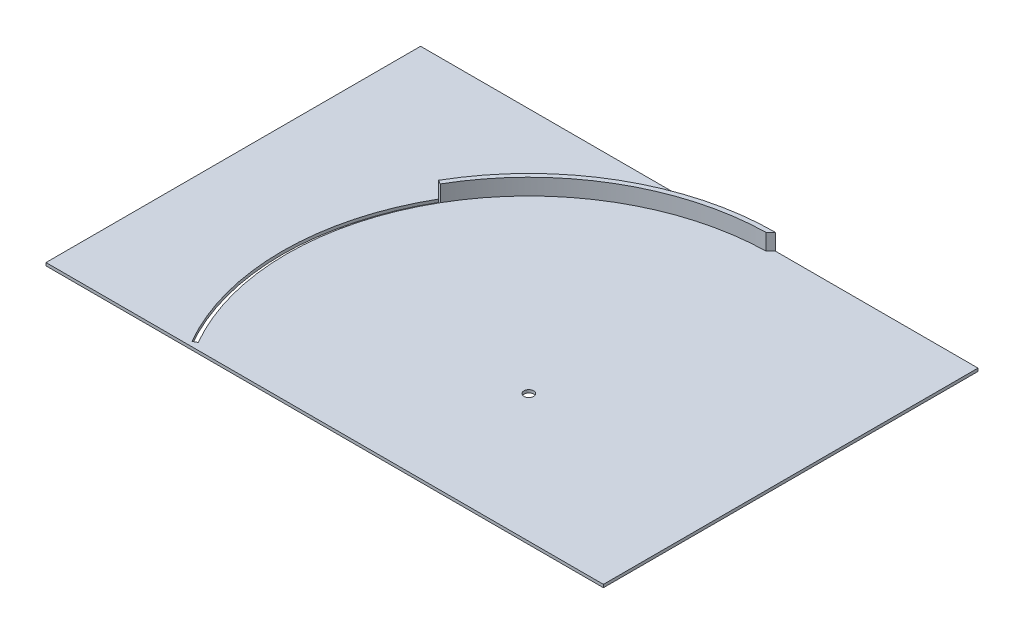
ISO-10303-21;
HEADER;
FILE_DESCRIPTION(('STEP AP214'),'2;1');
FILE_NAME('part.step','',(''),(''),'','','');
FILE_SCHEMA(('AUTOMOTIVE_DESIGN { 1 0 10303 214 1 1 1 1 }'));
ENDSEC;
DATA;
#1=APPLICATION_CONTEXT('core data for automotive mechanical design processes');
#2=APPLICATION_PROTOCOL_DEFINITION('international standard','automotive_design',2000,#1);
#3=PRODUCT_CONTEXT('',#1,'mechanical');
#4=PRODUCT('Part','Part','',(#3));
#5=PRODUCT_RELATED_PRODUCT_CATEGORY('part','',(#4));
#6=PRODUCT_DEFINITION_FORMATION('','',#4);
#7=PRODUCT_DEFINITION_CONTEXT('part definition',#1,'design');
#8=PRODUCT_DEFINITION('design','',#6,#7);
#9=PRODUCT_DEFINITION_SHAPE('','',#8);
#10=(LENGTH_UNIT() NAMED_UNIT(*) SI_UNIT(.MILLI.,.METRE.));
#11=(NAMED_UNIT(*) PLANE_ANGLE_UNIT() SI_UNIT($,.RADIAN.));
#12=(NAMED_UNIT(*) SI_UNIT($,.STERADIAN.) SOLID_ANGLE_UNIT());
#13=UNCERTAINTY_MEASURE_WITH_UNIT(LENGTH_MEASURE(1.E-05),#10,'distance_accuracy_value','');
#14=(GEOMETRIC_REPRESENTATION_CONTEXT(3) GLOBAL_UNCERTAINTY_ASSIGNED_CONTEXT((#13)) GLOBAL_UNIT_ASSIGNED_CONTEXT((#10,
#11,#12)) REPRESENTATION_CONTEXT('',''));
#15=CARTESIAN_POINT('',(0.,0.,0.));
#16=DIRECTION('',(0.,0.,1.));
#17=DIRECTION('',(1.,0.,0.));
#18=AXIS2_PLACEMENT_3D('',#15,#16,#17);
#19=CARTESIAN_POINT('',(0.,35.,0.));
#20=DIRECTION('',(0.,-1.,0.));
#21=DIRECTION('',(0.,0.,-1.));
#22=AXIS2_PLACEMENT_3D('',#19,#20,#21);
#23=CYLINDRICAL_SURFACE('',#22,521.);
#24=CARTESIAN_POINT('',(0.,0.,0.));
#25=DIRECTION('',(0.,-1.,0.));
#26=DIRECTION('',(0.,0.,1.));
#27=AXIS2_PLACEMENT_3D('',#24,#25,#26);
#28=CIRCLE('',#27,521.);
#29=CARTESIAN_POINT('',(-451.199235371692,0.,-260.5));
#30=VERTEX_POINT('',#29);
#31=CARTESIAN_POINT('',(-10.0978661013188,0.,-520.902133898681));
#32=VERTEX_POINT('',#31);
#33=EDGE_CURVE('E227',#30,#32,#28,.T.);
#34=ORIENTED_EDGE('',*,*,#33,.T.);
#35=DIRECTION('',(0.,-1.,0.));
#36=VECTOR('',#35,1.);
#37=CARTESIAN_POINT('',(-10.0978661013188,35.,-520.902133898681));
#38=LINE('',#37,#36);
#39=CARTESIAN_POINT('',(-10.0978661013188,35.,-520.902133898681));
#40=VERTEX_POINT('',#39);
#41=EDGE_CURVE('E70',#32,#40,#38,.F.);
#42=ORIENTED_EDGE('',*,*,#41,.T.);
#43=CARTESIAN_POINT('',(0.,35.,0.));
#44=DIRECTION('',(0.,-1.,0.));
#45=DIRECTION('',(0.,0.,1.));
#46=AXIS2_PLACEMENT_3D('',#43,#44,#45);
#47=CIRCLE('',#46,521.);
#48=CARTESIAN_POINT('',(-451.199235371692,35.,-260.5));
#49=VERTEX_POINT('',#48);
#50=EDGE_CURVE('E236',#49,#40,#47,.T.);
#51=ORIENTED_EDGE('',*,*,#50,.F.);
#52=DIRECTION('',(0.,-1.,0.));
#53=VECTOR('',#52,1.);
#54=CARTESIAN_POINT('',(-451.199235371692,35.,-260.5));
#55=LINE('',#54,#53);
#56=EDGE_CURVE('E246',#49,#30,#55,.T.);
#57=ORIENTED_EDGE('',*,*,#56,.T.);
#58=EDGE_LOOP('',(#34,#42,#51,#57));
#59=FACE_BOUND('',#58,.T.);
#60=ADVANCED_FACE('F45',(#59),#23,.F.);
#61=CARTESIAN_POINT('',(0.,35.,0.));
#62=DIRECTION('',(0.,-1.,0.));
#63=DIRECTION('',(0.,0.,-1.));
#64=AXIS2_PLACEMENT_3D('',#61,#62,#63);
#65=CYLINDRICAL_SURFACE('',#64,531.);
#66=CARTESIAN_POINT('',(0.,0.,0.));
#67=DIRECTION('',(0.,1.,0.));
#68=DIRECTION('',(0.,0.,1.));
#69=AXIS2_PLACEMENT_3D('',#66,#67,#68);
#70=CIRCLE('',#69,531.);
#71=CARTESIAN_POINT('',(0.,0.,-531.));
#72=VERTEX_POINT('',#71);
#73=CARTESIAN_POINT('',(-459.859489409537,0.,-265.500000000001));
#74=VERTEX_POINT('',#73);
#75=EDGE_CURVE('E240',#72,#74,#70,.T.);
#76=ORIENTED_EDGE('',*,*,#75,.T.);
#77=DIRECTION('',(0.,-1.,0.));
#78=VECTOR('',#77,1.);
#79=CARTESIAN_POINT('',(-459.859489409537,35.,-265.500000000001));
#80=LINE('',#79,#78);
#81=CARTESIAN_POINT('',(-459.859489409537,35.,-265.500000000001));
#82=VERTEX_POINT('',#81);
#83=EDGE_CURVE('E255',#82,#74,#80,.T.);
#84=ORIENTED_EDGE('',*,*,#83,.F.);
#85=CARTESIAN_POINT('',(0.,35.,0.));
#86=DIRECTION('',(0.,1.,0.));
#87=DIRECTION('',(0.,0.,1.));
#88=AXIS2_PLACEMENT_3D('',#85,#86,#87);
#89=CIRCLE('',#88,531.);
#90=CARTESIAN_POINT('',(0.,35.,-531.));
#91=VERTEX_POINT('',#90);
#92=EDGE_CURVE('E239',#91,#82,#89,.T.);
#93=ORIENTED_EDGE('',*,*,#92,.F.);
#94=DIRECTION('',(0.,-1.,0.));
#95=VECTOR('',#94,1.);
#96=CARTESIAN_POINT('',(0.,35.,-531.));
#97=LINE('',#96,#95);
#98=EDGE_CURVE('E258',#91,#72,#97,.T.);
#99=ORIENTED_EDGE('',*,*,#98,.T.);
#100=EDGE_LOOP('',(#76,#84,#93,#99));
#101=FACE_BOUND('',#100,.T.);
#102=ADVANCED_FACE('F272',(#101),#65,.T.);
#103=CARTESIAN_POINT('',(-459.859489409537,35.,-265.5));
#104=DIRECTION('',(0.499999999999987,0.,-0.866025403784446));
#105=DIRECTION('',(-0.866025403784446,0.,-0.499999999999987));
#106=AXIS2_PLACEMENT_3D('',#103,#104,#105);
#107=PLANE('',#106);
#108=ORIENTED_EDGE('',*,*,#83,.T.);
#109=DIRECTION('',(0.,1.,0.));
#110=VECTOR('',#109,1.);
#111=CARTESIAN_POINT('',(-459.859489409537,-6.35,-265.500000000001));
#112=LINE('',#111,#110);
#113=CARTESIAN_POINT('',(-459.859489409537,-6.35,-265.500000000001));
#114=VERTEX_POINT('',#113);
#115=EDGE_CURVE('E143',#114,#74,#112,.T.);
#116=ORIENTED_EDGE('',*,*,#115,.F.);
#117=DIRECTION('',(-0.866025403784432,0.,-0.500000000000011));
#118=VECTOR('',#117,1.);
#119=CARTESIAN_POINT('',(-451.199235371692,-6.35,-260.5));
#120=LINE('',#119,#118);
#121=CARTESIAN_POINT('',(-451.199235371692,-6.35,-260.5));
#122=VERTEX_POINT('',#121);
#123=EDGE_CURVE('E147',#122,#114,#120,.T.);
#124=ORIENTED_EDGE('',*,*,#123,.F.);
#125=DIRECTION('',(0.,1.,0.));
#126=VECTOR('',#125,1.);
#127=CARTESIAN_POINT('',(-451.199235371692,-6.35,-260.5));
#128=LINE('',#127,#126);
#129=EDGE_CURVE('E131',#122,#30,#128,.T.);
#130=ORIENTED_EDGE('',*,*,#129,.T.);
#131=ORIENTED_EDGE('',*,*,#56,.F.);
#132=DIRECTION('',(0.866025403784446,0.,0.499999999999987));
#133=VECTOR('',#132,1.);
#134=CARTESIAN_POINT('',(-459.859489409537,35.,-265.5));
#135=LINE('',#134,#133);
#136=EDGE_CURVE('E243',#82,#49,#135,.T.);
#137=ORIENTED_EDGE('',*,*,#136,.F.);
#138=EDGE_LOOP('',(#108,#116,#124,#130,#131,#137));
#139=FACE_BOUND('',#138,.T.);
#140=ADVANCED_FACE('F149',(#139),#107,.F.);
#141=CARTESIAN_POINT('',(0.,35.,0.));
#142=DIRECTION('',(0.,1.,0.));
#143=DIRECTION('',(0.,0.,1.));
#144=AXIS2_PLACEMENT_3D('',#141,#142,#143);
#145=PLANE('',#144);
#146=ORIENTED_EDGE('',*,*,#50,.T.);
#147=DIRECTION('',(-0.707106781186547,0.,0.707106781186548));
#148=VECTOR('',#147,1.);
#149=CARTESIAN_POINT('',(-265.5,35.,-265.5));
#150=LINE('',#149,#148);
#151=EDGE_CURVE('E55',#40,#91,#150,.F.);
#152=ORIENTED_EDGE('',*,*,#151,.T.);
#153=ORIENTED_EDGE('',*,*,#92,.T.);
#154=ORIENTED_EDGE('',*,*,#136,.T.);
#155=EDGE_LOOP('',(#146,#152,#153,#154));
#156=FACE_BOUND('',#155,.T.);
#157=ADVANCED_FACE('F267',(#156),#145,.T.);
#158=CARTESIAN_POINT('',(-764.07,-6.35,275.4));
#159=DIRECTION('',(-1.,0.,0.));
#160=DIRECTION('',(0.,0.,1.));
#161=AXIS2_PLACEMENT_3D('',#158,#159,#160);
#162=PLANE('',#161);
#163=DIRECTION('',(0.,0.,1.));
#164=VECTOR('',#163,1.);
#165=CARTESIAN_POINT('',(-764.07,0.,275.4));
#166=LINE('',#165,#164);
#167=CARTESIAN_POINT('',(-764.07,0.,-531.));
#168=VERTEX_POINT('',#167);
#169=CARTESIAN_POINT('',(-764.07,0.,275.4));
#170=VERTEX_POINT('',#169);
#171=EDGE_CURVE('E189',#168,#170,#166,.T.);
#172=ORIENTED_EDGE('',*,*,#171,.F.);
#173=DIRECTION('',(0.,1.,0.));
#174=VECTOR('',#173,1.);
#175=CARTESIAN_POINT('',(-764.07,-6.35,-531.));
#176=LINE('',#175,#174);
#177=CARTESIAN_POINT('',(-764.07,-6.35,-531.));
#178=VERTEX_POINT('',#177);
#179=EDGE_CURVE('E223',#178,#168,#176,.T.);
#180=ORIENTED_EDGE('',*,*,#179,.F.);
#181=DIRECTION('',(0.,0.,1.));
#182=VECTOR('',#181,1.);
#183=CARTESIAN_POINT('',(-764.07,-6.35,275.4));
#184=LINE('',#183,#182);
#185=CARTESIAN_POINT('',(-764.07,-6.35,275.4));
#186=VERTEX_POINT('',#185);
#187=EDGE_CURVE('E190',#178,#186,#184,.T.);
#188=ORIENTED_EDGE('',*,*,#187,.T.);
#189=DIRECTION('',(0.,1.,0.));
#190=VECTOR('',#189,1.);
#191=CARTESIAN_POINT('',(-764.07,-6.35,275.4));
#192=LINE('',#191,#190);
#193=EDGE_CURVE('E207',#186,#170,#192,.T.);
#194=ORIENTED_EDGE('',*,*,#193,.T.);
#195=EDGE_LOOP('',(#172,#180,#188,#194));
#196=FACE_BOUND('',#195,.T.);
#197=ADVANCED_FACE('F296',(#196),#162,.T.);
#198=CARTESIAN_POINT('',(-764.07,-6.35,-531.));
#199=DIRECTION('',(0.,0.,-1.));
#200=DIRECTION('',(-1.,0.,0.));
#201=AXIS2_PLACEMENT_3D('',#198,#199,#200);
#202=PLANE('',#201);
#203=DIRECTION('',(-1.,0.,0.));
#204=VECTOR('',#203,1.);
#205=CARTESIAN_POINT('',(-764.07,0.,-531.));
#206=LINE('',#205,#204);
#207=CARTESIAN_POINT('',(435.93,0.,-531.));
#208=VERTEX_POINT('',#207);
#209=EDGE_CURVE('E195',#208,#72,#206,.T.);
#210=ORIENTED_EDGE('',*,*,#209,.F.);
#211=DIRECTION('',(0.,1.,0.));
#212=VECTOR('',#211,1.);
#213=CARTESIAN_POINT('',(435.93,-6.35,-531.));
#214=LINE('',#213,#212);
#215=CARTESIAN_POINT('',(435.93,-6.35,-531.));
#216=VERTEX_POINT('',#215);
#217=EDGE_CURVE('E228',#216,#208,#214,.T.);
#218=ORIENTED_EDGE('',*,*,#217,.F.);
#219=DIRECTION('',(-1.,0.,0.));
#220=VECTOR('',#219,1.);
#221=CARTESIAN_POINT('',(-764.07,-6.35,-531.));
#222=LINE('',#221,#220);
#223=EDGE_CURVE('E203',#216,#178,#222,.T.);
#224=ORIENTED_EDGE('',*,*,#223,.T.);
#225=ORIENTED_EDGE('',*,*,#179,.T.);
#226=EDGE_CURVE('E219',#72,#168,#206,.T.);
#227=ORIENTED_EDGE('',*,*,#226,.F.);
#228=EDGE_LOOP('',(#210,#218,#224,#225,#227));
#229=FACE_BOUND('',#228,.T.);
#230=ADVANCED_FACE('F281',(#229),#202,.T.);
#231=CARTESIAN_POINT('',(435.93,-6.35,275.4));
#232=DIRECTION('',(1.,0.,0.));
#233=DIRECTION('',(0.,0.,-1.));
#234=AXIS2_PLACEMENT_3D('',#231,#232,#233);
#235=PLANE('',#234);
#236=DIRECTION('',(0.,0.,-1.));
#237=VECTOR('',#236,1.);
#238=CARTESIAN_POINT('',(435.93,0.,275.4));
#239=LINE('',#238,#237);
#240=CARTESIAN_POINT('',(435.93,0.,275.4));
#241=VERTEX_POINT('',#240);
#242=EDGE_CURVE('E215',#241,#208,#239,.T.);
#243=ORIENTED_EDGE('',*,*,#242,.F.);
#244=DIRECTION('',(0.,1.,0.));
#245=VECTOR('',#244,1.);
#246=CARTESIAN_POINT('',(435.93,-6.35,275.4));
#247=LINE('',#246,#245);
#248=CARTESIAN_POINT('',(435.93,-6.35,275.4));
#249=VERTEX_POINT('',#248);
#250=EDGE_CURVE('E231',#249,#241,#247,.T.);
#251=ORIENTED_EDGE('',*,*,#250,.F.);
#252=DIRECTION('',(0.,0.,-1.));
#253=VECTOR('',#252,1.);
#254=CARTESIAN_POINT('',(435.93,-6.35,275.4));
#255=LINE('',#254,#253);
#256=EDGE_CURVE('E199',#249,#216,#255,.T.);
#257=ORIENTED_EDGE('',*,*,#256,.T.);
#258=ORIENTED_EDGE('',*,*,#217,.T.);
#259=EDGE_LOOP('',(#243,#251,#257,#258));
#260=FACE_BOUND('',#259,.T.);
#261=ADVANCED_FACE('F303',(#260),#235,.T.);
#262=CARTESIAN_POINT('',(-764.07,-6.35,275.4));
#263=DIRECTION('',(0.,0.,1.));
#264=DIRECTION('',(1.,0.,0.));
#265=AXIS2_PLACEMENT_3D('',#262,#263,#264);
#266=PLANE('',#265);
#267=DIRECTION('',(1.,0.,0.));
#268=VECTOR('',#267,1.);
#269=CARTESIAN_POINT('',(-764.07,0.,275.4));
#270=LINE('',#269,#268);
#271=EDGE_CURVE('E211',#170,#241,#270,.T.);
#272=ORIENTED_EDGE('',*,*,#271,.F.);
#273=ORIENTED_EDGE('',*,*,#193,.F.);
#274=DIRECTION('',(1.,0.,0.));
#275=VECTOR('',#274,1.);
#276=CARTESIAN_POINT('',(-764.07,-6.35,275.4));
#277=LINE('',#276,#275);
#278=EDGE_CURVE('E194',#186,#249,#277,.T.);
#279=ORIENTED_EDGE('',*,*,#278,.T.);
#280=ORIENTED_EDGE('',*,*,#250,.T.);
#281=EDGE_LOOP('',(#272,#273,#279,#280));
#282=FACE_BOUND('',#281,.T.);
#283=ADVANCED_FACE('F300',(#282),#266,.T.);
#284=CARTESIAN_POINT('',(0.,-6.35,0.));
#285=DIRECTION('',(0.,-1.,0.));
#286=DIRECTION('',(0.,0.,-1.));
#287=AXIS2_PLACEMENT_3D('',#284,#285,#286);
#288=PLANE('',#287);
#289=CARTESIAN_POINT('',(0.,-6.35,0.));
#290=DIRECTION('',(0.,-1.,0.));
#291=DIRECTION('',(0.,0.,1.));
#292=AXIS2_PLACEMENT_3D('',#289,#290,#291);
#293=CIRCLE('',#292,521.);
#294=CARTESIAN_POINT('',(-451.199235371692,-6.35,260.500000000001));
#295=VERTEX_POINT('',#294);
#296=EDGE_CURVE('E135',#295,#122,#293,.T.);
#297=ORIENTED_EDGE('',*,*,#296,.T.);
#298=ORIENTED_EDGE('',*,*,#123,.T.);
#299=CARTESIAN_POINT('',(0.,-6.35,0.));
#300=DIRECTION('',(0.,1.,0.));
#301=DIRECTION('',(0.,0.,1.));
#302=AXIS2_PLACEMENT_3D('',#299,#300,#301);
#303=CIRCLE('',#302,531.);
#304=CARTESIAN_POINT('',(-459.859489409537,-6.35,265.5));
#305=VERTEX_POINT('',#304);
#306=EDGE_CURVE('E62',#114,#305,#303,.T.);
#307=ORIENTED_EDGE('',*,*,#306,.T.);
#308=DIRECTION('',(0.866025403784439,0.,-0.499999999999999));
#309=VECTOR('',#308,1.);
#310=CARTESIAN_POINT('',(-451.199235371692,-6.35,260.500000000001));
#311=LINE('',#310,#309);
#312=EDGE_CURVE('E144',#305,#295,#311,.T.);
#313=ORIENTED_EDGE('',*,*,#312,.T.);
#314=EDGE_LOOP('',(#297,#298,#307,#313));
#315=FACE_BOUND('',#314,.T.);
#316=CARTESIAN_POINT('',(0.,-6.35,0.));
#317=DIRECTION('',(0.,1.,0.));
#318=DIRECTION('',(0.,0.,1.));
#319=AXIS2_PLACEMENT_3D('',#316,#317,#318);
#320=CIRCLE('',#319,10.5);
#321=CARTESIAN_POINT('',(0.,-6.35,10.5));
#322=VERTEX_POINT('',#321);
#323=EDGE_CURVE('E185',#322,#322,#320,.T.);
#324=ORIENTED_EDGE('',*,*,#323,.T.);
#325=EDGE_LOOP('',(#324));
#326=FACE_BOUND('',#325,.T.);
#327=ORIENTED_EDGE('',*,*,#187,.F.);
#328=ORIENTED_EDGE('',*,*,#223,.F.);
#329=ORIENTED_EDGE('',*,*,#256,.F.);
#330=ORIENTED_EDGE('',*,*,#278,.F.);
#331=EDGE_LOOP('',(#327,#328,#329,#330));
#332=FACE_BOUND('',#331,.T.);
#333=ADVANCED_FACE('F153',(#315,#326,#332),#288,.T.);
#334=CARTESIAN_POINT('',(0.,0.,0.));
#335=DIRECTION('',(0.,-1.,0.));
#336=DIRECTION('',(0.,0.,-1.));
#337=AXIS2_PLACEMENT_3D('',#334,#335,#336);
#338=PLANE('',#337);
#339=CARTESIAN_POINT('',(0.,0.,0.));
#340=DIRECTION('',(0.,1.,0.));
#341=DIRECTION('',(0.,0.,1.));
#342=AXIS2_PLACEMENT_3D('',#339,#340,#341);
#343=CIRCLE('',#342,10.5);
#344=CARTESIAN_POINT('',(0.,0.,10.5));
#345=VERTEX_POINT('',#344);
#346=EDGE_CURVE('E176',#345,#345,#343,.T.);
#347=ORIENTED_EDGE('',*,*,#346,.F.);
#348=EDGE_LOOP('',(#347));
#349=FACE_BOUND('',#348,.T.);
#350=ORIENTED_EDGE('',*,*,#33,.F.);
#351=CARTESIAN_POINT('',(0.,0.,0.));
#352=DIRECTION('',(0.,-1.,0.));
#353=DIRECTION('',(0.,0.,1.));
#354=AXIS2_PLACEMENT_3D('',#351,#352,#353);
#355=CIRCLE('',#354,521.);
#356=CARTESIAN_POINT('',(-451.199235371692,0.,260.500000000001));
#357=VERTEX_POINT('',#356);
#358=EDGE_CURVE('E138',#357,#30,#355,.T.);
#359=ORIENTED_EDGE('',*,*,#358,.F.);
#360=DIRECTION('',(0.866025403784439,0.,-0.499999999999999));
#361=VECTOR('',#360,1.);
#362=CARTESIAN_POINT('',(-451.199235371692,0.,260.500000000001));
#363=LINE('',#362,#361);
#364=CARTESIAN_POINT('',(-459.859489409537,0.,265.5));
#365=VERTEX_POINT('',#364);
#366=EDGE_CURVE('E157',#365,#357,#363,.T.);
#367=ORIENTED_EDGE('',*,*,#366,.F.);
#368=CARTESIAN_POINT('',(0.,0.,0.));
#369=DIRECTION('',(0.,1.,0.));
#370=DIRECTION('',(0.,0.,1.));
#371=AXIS2_PLACEMENT_3D('',#368,#369,#370);
#372=CIRCLE('',#371,531.);
#373=EDGE_CURVE('E161',#74,#365,#372,.T.);
#374=ORIENTED_EDGE('',*,*,#373,.F.);
#375=ORIENTED_EDGE('',*,*,#75,.F.);
#376=ORIENTED_EDGE('',*,*,#226,.T.);
#377=ORIENTED_EDGE('',*,*,#171,.T.);
#378=ORIENTED_EDGE('',*,*,#271,.T.);
#379=ORIENTED_EDGE('',*,*,#242,.T.);
#380=ORIENTED_EDGE('',*,*,#209,.T.);
#381=DIRECTION('',(0.707106781186547,0.,-0.707106781186548));
#382=VECTOR('',#381,1.);
#383=CARTESIAN_POINT('',(-265.5,0.,-265.5));
#384=LINE('',#383,#382);
#385=EDGE_CURVE('E11',#72,#32,#384,.F.);
#386=ORIENTED_EDGE('',*,*,#385,.T.);
#387=EDGE_LOOP('',(#350,#359,#367,#374,#375,#376,#377,#378,#379,#380,#386));
#388=FACE_BOUND('',#387,.T.);
#389=ADVANCED_FACE('F277',(#349,#388),#338,.F.);
#390=CARTESIAN_POINT('',(0.,35.,-531.));
#391=DIRECTION('',(-0.707106781186548,0.,-0.707106781186547));
#392=DIRECTION('',(0.,-1.,0.));
#393=AXIS2_PLACEMENT_3D('',#390,#391,#392);
#394=PLANE('',#393);
#395=ORIENTED_EDGE('',*,*,#151,.F.);
#396=ORIENTED_EDGE('',*,*,#41,.F.);
#397=ORIENTED_EDGE('',*,*,#385,.F.);
#398=ORIENTED_EDGE('',*,*,#98,.F.);
#399=EDGE_LOOP('',(#395,#396,#397,#398));
#400=FACE_BOUND('',#399,.T.);
#401=ADVANCED_FACE('F48',(#400),#394,.F.);
#402=CARTESIAN_POINT('',(0.,0.,0.));
#403=DIRECTION('',(0.,1.,0.));
#404=DIRECTION('',(0.,0.,1.));
#405=AXIS2_PLACEMENT_3D('',#402,#403,#404);
#406=CYLINDRICAL_SURFACE('',#405,10.5);
#407=ORIENTED_EDGE('',*,*,#323,.F.);
#408=EDGE_LOOP('',(#407));
#409=FACE_BOUND('',#408,.T.);
#410=ORIENTED_EDGE('',*,*,#346,.T.);
#411=EDGE_LOOP('',(#410));
#412=FACE_BOUND('',#411,.T.);
#413=ADVANCED_FACE('F315',(#409,#412),#406,.F.);
#414=CARTESIAN_POINT('',(0.,-6.35,0.));
#415=DIRECTION('',(0.,1.,0.));
#416=DIRECTION('',(0.,0.,1.));
#417=AXIS2_PLACEMENT_3D('',#414,#415,#416);
#418=CYLINDRICAL_SURFACE('',#417,521.);
#419=ORIENTED_EDGE('',*,*,#358,.T.);
#420=ORIENTED_EDGE('',*,*,#129,.F.);
#421=ORIENTED_EDGE('',*,*,#296,.F.);
#422=DIRECTION('',(0.,1.,0.));
#423=VECTOR('',#422,1.);
#424=CARTESIAN_POINT('',(-451.199235371692,-6.35,260.500000000001));
#425=LINE('',#424,#423);
#426=EDGE_CURVE('E173',#295,#357,#425,.T.);
#427=ORIENTED_EDGE('',*,*,#426,.T.);
#428=EDGE_LOOP('',(#419,#420,#421,#427));
#429=FACE_BOUND('',#428,.T.);
#430=ADVANCED_FACE('F133',(#429),#418,.T.);
#431=CARTESIAN_POINT('',(-451.199235371692,-6.35,260.500000000001));
#432=DIRECTION('',(0.499999999999999,0.,0.866025403784439));
#433=DIRECTION('',(0.866025403784439,0.,-0.499999999999999));
#434=AXIS2_PLACEMENT_3D('',#431,#432,#433);
#435=PLANE('',#434);
#436=ORIENTED_EDGE('',*,*,#366,.T.);
#437=ORIENTED_EDGE('',*,*,#426,.F.);
#438=ORIENTED_EDGE('',*,*,#312,.F.);
#439=DIRECTION('',(0.,1.,0.));
#440=VECTOR('',#439,1.);
#441=CARTESIAN_POINT('',(-459.859489409537,-6.35,265.5));
#442=LINE('',#441,#440);
#443=EDGE_CURVE('E177',#305,#365,#442,.T.);
#444=ORIENTED_EDGE('',*,*,#443,.T.);
#445=EDGE_LOOP('',(#436,#437,#438,#444));
#446=FACE_BOUND('',#445,.T.);
#447=ADVANCED_FACE('F321',(#446),#435,.F.);
#448=CARTESIAN_POINT('',(0.,-6.35,0.));
#449=DIRECTION('',(0.,1.,0.));
#450=DIRECTION('',(0.,0.,1.));
#451=AXIS2_PLACEMENT_3D('',#448,#449,#450);
#452=CYLINDRICAL_SURFACE('',#451,531.);
#453=ORIENTED_EDGE('',*,*,#373,.T.);
#454=ORIENTED_EDGE('',*,*,#443,.F.);
#455=ORIENTED_EDGE('',*,*,#306,.F.);
#456=ORIENTED_EDGE('',*,*,#115,.T.);
#457=EDGE_LOOP('',(#453,#454,#455,#456));
#458=FACE_BOUND('',#457,.T.);
#459=ADVANCED_FACE('F322',(#458),#452,.F.);
#460=CLOSED_SHELL('',(#60,#102,#140,#157,#197,#230,#261,#283,#333,#389,#401,#413,#430,#447,#459));
#461=MANIFOLD_SOLID_BREP('B2',#460);
#462=ADVANCED_BREP_SHAPE_REPRESENTATION('',(#18,#461),#14);
#463=SHAPE_DEFINITION_REPRESENTATION(#9,#462);
ENDSEC;
END-ISO-10303-21;
